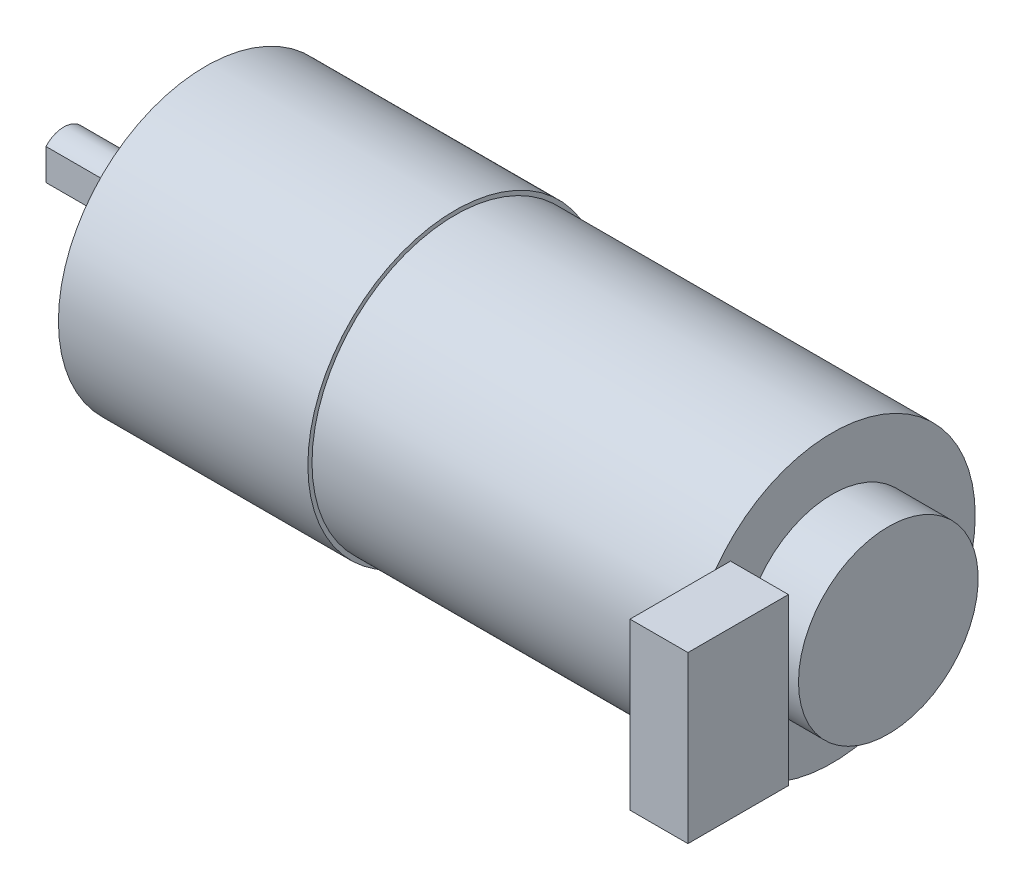
ISO-10303-21;
HEADER;
FILE_DESCRIPTION(('STEP AP214'),'2;1');
FILE_NAME('part.step','',(''),(''),'','','');
FILE_SCHEMA(('AUTOMOTIVE_DESIGN { 1 0 10303 214 1 1 1 1 }'));
ENDSEC;
DATA;
#1=APPLICATION_CONTEXT('core data for automotive mechanical design processes');
#2=APPLICATION_PROTOCOL_DEFINITION('international standard','automotive_design',2000,#1);
#3=PRODUCT_CONTEXT('',#1,'mechanical');
#4=PRODUCT('Part','Part','',(#3));
#5=PRODUCT_RELATED_PRODUCT_CATEGORY('part','',(#4));
#6=PRODUCT_DEFINITION_FORMATION('','',#4);
#7=PRODUCT_DEFINITION_CONTEXT('part definition',#1,'design');
#8=PRODUCT_DEFINITION('design','',#6,#7);
#9=PRODUCT_DEFINITION_SHAPE('','',#8);
#10=(LENGTH_UNIT() NAMED_UNIT(*) SI_UNIT(.MILLI.,.METRE.));
#11=(NAMED_UNIT(*) PLANE_ANGLE_UNIT() SI_UNIT($,.RADIAN.));
#12=(NAMED_UNIT(*) SI_UNIT($,.STERADIAN.) SOLID_ANGLE_UNIT());
#13=UNCERTAINTY_MEASURE_WITH_UNIT(LENGTH_MEASURE(1.E-05),#10,'distance_accuracy_value','');
#14=(GEOMETRIC_REPRESENTATION_CONTEXT(3) GLOBAL_UNCERTAINTY_ASSIGNED_CONTEXT((#13)) GLOBAL_UNIT_ASSIGNED_CONTEXT((#10,
#11,#12)) REPRESENTATION_CONTEXT('',''));
#15=CARTESIAN_POINT('',(0.,0.,0.));
#16=DIRECTION('',(0.,0.,1.));
#17=DIRECTION('',(1.,0.,0.));
#18=AXIS2_PLACEMENT_3D('',#15,#16,#17);
#19=CARTESIAN_POINT('',(-65.,0.,0.));
#20=DIRECTION('',(1.,0.,0.));
#21=DIRECTION('',(0.,0.,-1.));
#22=AXIS2_PLACEMENT_3D('',#19,#20,#21);
#23=PLANE('',#22);
#24=DIRECTION('',(0.,1.,0.));
#25=VECTOR('',#24,1.);
#26=CARTESIAN_POINT('',(-65.,0.,-10.6));
#27=LINE('',#26,#25);
#28=CARTESIAN_POINT('',(-65.,-1.3228756555323,-10.6));
#29=VERTEX_POINT('',#28);
#30=CARTESIAN_POINT('',(-65.,1.3228756555323,-10.6));
#31=VERTEX_POINT('',#30);
#32=EDGE_CURVE('E115',#29,#31,#27,.T.);
#33=ORIENTED_EDGE('',*,*,#32,.T.);
#34=CARTESIAN_POINT('',(-65.,0.,-12.1));
#35=DIRECTION('',(-1.,0.,0.));
#36=DIRECTION('',(0.,0.,1.));
#37=AXIS2_PLACEMENT_3D('',#34,#35,#36);
#38=CIRCLE('',#37,2.);
#39=EDGE_CURVE('E210',#31,#29,#38,.T.);
#40=ORIENTED_EDGE('',*,*,#39,.T.);
#41=EDGE_LOOP('',(#33,#40));
#42=FACE_BOUND('',#41,.T.);
#43=ADVANCED_FACE('F46',(#42),#23,.F.);
#44=CARTESIAN_POINT('',(-65.,0.,-12.1));
#45=DIRECTION('',(-1.,0.,0.));
#46=DIRECTION('',(0.,0.,1.));
#47=AXIS2_PLACEMENT_3D('',#44,#45,#46);
#48=CYLINDRICAL_SURFACE('',#47,2.);
#49=CARTESIAN_POINT('',(-55.5,0.,-12.1));
#50=DIRECTION('',(-1.,0.,0.));
#51=DIRECTION('',(0.,0.,1.));
#52=AXIS2_PLACEMENT_3D('',#49,#50,#51);
#53=CIRCLE('',#52,2.);
#54=CARTESIAN_POINT('',(-55.5,0.,-10.1));
#55=VERTEX_POINT('',#54);
#56=EDGE_CURVE('E206',#55,#55,#53,.T.);
#57=ORIENTED_EDGE('',*,*,#56,.T.);
#58=EDGE_LOOP('',(#57));
#59=FACE_BOUND('',#58,.T.);
#60=DIRECTION('',(-1.,0.,0.));
#61=VECTOR('',#60,1.);
#62=CARTESIAN_POINT('',(-57.,1.3228756555323,-10.6));
#63=LINE('',#62,#61);
#64=CARTESIAN_POINT('',(-57.,1.3228756555323,-10.6));
#65=VERTEX_POINT('',#64);
#66=EDGE_CURVE('E168',#65,#31,#63,.T.);
#67=ORIENTED_EDGE('',*,*,#66,.F.);
#68=CARTESIAN_POINT('',(-57.,0.,-12.1));
#69=DIRECTION('',(-1.,0.,0.));
#70=DIRECTION('',(0.,0.,1.));
#71=AXIS2_PLACEMENT_3D('',#68,#69,#70);
#72=CIRCLE('',#71,2.);
#73=CARTESIAN_POINT('',(-57.,-1.3228756555323,-10.6));
#74=VERTEX_POINT('',#73);
#75=EDGE_CURVE('E160',#74,#65,#72,.T.);
#76=ORIENTED_EDGE('',*,*,#75,.F.);
#77=DIRECTION('',(-1.,0.,0.));
#78=VECTOR('',#77,1.);
#79=CARTESIAN_POINT('',(-57.,-1.3228756555323,-10.6));
#80=LINE('',#79,#78);
#81=EDGE_CURVE('E164',#74,#29,#80,.T.);
#82=ORIENTED_EDGE('',*,*,#81,.T.);
#83=ORIENTED_EDGE('',*,*,#39,.F.);
#84=EDGE_LOOP('',(#67,#76,#82,#83));
#85=FACE_BOUND('',#84,.T.);
#86=ADVANCED_FACE('F249',(#59,#85),#48,.T.);
#87=CARTESIAN_POINT('',(-55.5,0.,2.56739074444567E-13));
#88=DIRECTION('',(1.,0.,0.));
#89=DIRECTION('',(0.,0.,-1.));
#90=AXIS2_PLACEMENT_3D('',#87,#88,#89);
#91=PLANE('',#90);
#92=ORIENTED_EDGE('',*,*,#56,.F.);
#93=EDGE_LOOP('',(#92));
#94=FACE_BOUND('',#93,.T.);
#95=CARTESIAN_POINT('',(-55.5,0.,-12.1));
#96=DIRECTION('',(-1.,0.,0.));
#97=DIRECTION('',(0.,0.,1.));
#98=AXIS2_PLACEMENT_3D('',#95,#96,#97);
#99=CIRCLE('',#98,3.5);
#100=CARTESIAN_POINT('',(-55.5,0.,-8.59999999999999));
#101=VERTEX_POINT('',#100);
#102=EDGE_CURVE('E202',#101,#101,#99,.T.);
#103=ORIENTED_EDGE('',*,*,#102,.T.);
#104=EDGE_LOOP('',(#103));
#105=FACE_BOUND('',#104,.T.);
#106=ADVANCED_FACE('F254',(#94,#105),#91,.F.);
#107=CARTESIAN_POINT('',(-65.,0.,-12.1));
#108=DIRECTION('',(-1.,0.,0.));
#109=DIRECTION('',(0.,0.,1.));
#110=AXIS2_PLACEMENT_3D('',#107,#108,#109);
#111=CYLINDRICAL_SURFACE('',#110,3.5);
#112=ORIENTED_EDGE('',*,*,#102,.F.);
#113=EDGE_LOOP('',(#112));
#114=FACE_BOUND('',#113,.T.);
#115=CARTESIAN_POINT('',(-53.,0.,-12.1));
#116=DIRECTION('',(-1.,0.,0.));
#117=DIRECTION('',(0.,0.,1.));
#118=AXIS2_PLACEMENT_3D('',#115,#116,#117);
#119=CIRCLE('',#118,3.5);
#120=CARTESIAN_POINT('',(-53.,0.,-8.59999999999999));
#121=VERTEX_POINT('',#120);
#122=EDGE_CURVE('E198',#121,#121,#119,.T.);
#123=ORIENTED_EDGE('',*,*,#122,.T.);
#124=EDGE_LOOP('',(#123));
#125=FACE_BOUND('',#124,.T.);
#126=ADVANCED_FACE('F406',(#114,#125),#111,.T.);
#127=CARTESIAN_POINT('',(-53.,0.,0.));
#128=DIRECTION('',(1.,0.,0.));
#129=DIRECTION('',(0.,0.,-1.));
#130=AXIS2_PLACEMENT_3D('',#127,#128,#129);
#131=PLANE('',#130);
#132=ORIENTED_EDGE('',*,*,#122,.F.);
#133=EDGE_LOOP('',(#132));
#134=FACE_BOUND('',#133,.T.);
#135=CARTESIAN_POINT('',(-53.,0.,-12.1));
#136=DIRECTION('',(-1.,0.,0.));
#137=DIRECTION('',(0.,0.,1.));
#138=AXIS2_PLACEMENT_3D('',#135,#136,#137);
#139=CIRCLE('',#138,12.45);
#140=CARTESIAN_POINT('',(-53.,0.,0.35000000000001));
#141=VERTEX_POINT('',#140);
#142=EDGE_CURVE('E194',#141,#141,#139,.T.);
#143=ORIENTED_EDGE('',*,*,#142,.T.);
#144=EDGE_LOOP('',(#143));
#145=FACE_BOUND('',#144,.T.);
#146=ADVANCED_FACE('F395',(#134,#145),#131,.F.);
#147=CARTESIAN_POINT('',(-65.,0.,-12.1));
#148=DIRECTION('',(-1.,0.,0.));
#149=DIRECTION('',(0.,0.,1.));
#150=AXIS2_PLACEMENT_3D('',#147,#148,#149);
#151=CYLINDRICAL_SURFACE('',#150,12.45);
#152=CARTESIAN_POINT('',(-31.9,0.,-12.1));
#153=DIRECTION('',(-1.,0.,0.));
#154=DIRECTION('',(0.,0.,1.));
#155=AXIS2_PLACEMENT_3D('',#152,#153,#154);
#156=CIRCLE('',#155,12.45);
#157=CARTESIAN_POINT('',(-31.9,0.,0.350000000000008));
#158=VERTEX_POINT('',#157);
#159=EDGE_CURVE('E190',#158,#158,#156,.T.);
#160=ORIENTED_EDGE('',*,*,#159,.T.);
#161=EDGE_LOOP('',(#160));
#162=FACE_BOUND('',#161,.T.);
#163=ORIENTED_EDGE('',*,*,#142,.F.);
#164=EDGE_LOOP('',(#163));
#165=FACE_BOUND('',#164,.T.);
#166=ADVANCED_FACE('F384',(#162,#165),#151,.T.);
#167=CARTESIAN_POINT('',(-31.9,0.,6.32430615813249E-13));
#168=DIRECTION('',(1.,0.,0.));
#169=DIRECTION('',(0.,0.,-1.));
#170=AXIS2_PLACEMENT_3D('',#167,#168,#169);
#171=PLANE('',#170);
#172=CARTESIAN_POINT('',(-31.9,0.,-12.1));
#173=DIRECTION('',(-1.,0.,0.));
#174=DIRECTION('',(0.,0.,1.));
#175=AXIS2_PLACEMENT_3D('',#172,#173,#174);
#176=CIRCLE('',#175,12.1);
#177=CARTESIAN_POINT('',(-31.9,0.,0.));
#178=VERTEX_POINT('',#177);
#179=EDGE_CURVE('E186',#178,#178,#176,.T.);
#180=ORIENTED_EDGE('',*,*,#179,.T.);
#181=EDGE_LOOP('',(#180));
#182=FACE_BOUND('',#181,.T.);
#183=ORIENTED_EDGE('',*,*,#159,.F.);
#184=EDGE_LOOP('',(#183));
#185=FACE_BOUND('',#184,.T.);
#186=ADVANCED_FACE('F339',(#182,#185),#171,.T.);
#187=CARTESIAN_POINT('',(-65.,0.,-12.1));
#188=DIRECTION('',(-1.,0.,0.));
#189=DIRECTION('',(0.,0.,1.));
#190=AXIS2_PLACEMENT_3D('',#187,#188,#189);
#191=CYLINDRICAL_SURFACE('',#190,12.1);
#192=ORIENTED_EDGE('',*,*,#179,.F.);
#193=EDGE_LOOP('',(#192));
#194=FACE_BOUND('',#193,.T.);
#195=CARTESIAN_POINT('',(0.,0.,-12.1));
#196=DIRECTION('',(-1.,0.,0.));
#197=DIRECTION('',(0.,0.,1.));
#198=AXIS2_PLACEMENT_3D('',#195,#196,#197);
#199=CIRCLE('',#198,12.1);
#200=CARTESIAN_POINT('',(0.,7.,-2.23034955026268));
#201=VERTEX_POINT('',#200);
#202=CARTESIAN_POINT('',(0.,-7.,-2.23034955026268));
#203=VERTEX_POINT('',#202);
#204=EDGE_CURVE('E183',#201,#203,#199,.T.);
#205=ORIENTED_EDGE('',*,*,#204,.T.);
#206=EDGE_CURVE('E182',#203,#201,#199,.T.);
#207=ORIENTED_EDGE('',*,*,#206,.T.);
#208=EDGE_LOOP('',(#205,#207));
#209=FACE_BOUND('',#208,.T.);
#210=ADVANCED_FACE('F225',(#194,#209),#191,.T.);
#211=CARTESIAN_POINT('',(0.,0.,0.));
#212=DIRECTION('',(-1.,0.,0.));
#213=DIRECTION('',(0.,0.,1.));
#214=AXIS2_PLACEMENT_3D('',#211,#212,#213);
#215=PLANE('',#214);
#216=ORIENTED_EDGE('',*,*,#204,.F.);
#217=DIRECTION('',(0.,0.,-1.));
#218=VECTOR('',#217,1.);
#219=CARTESIAN_POINT('',(0.,7.,0.));
#220=LINE('',#219,#218);
#221=CARTESIAN_POINT('',(0.,7.,-3.5));
#222=VERTEX_POINT('',#221);
#223=EDGE_CURVE('E12',#201,#222,#220,.T.);
#224=ORIENTED_EDGE('',*,*,#223,.T.);
#225=DIRECTION('',(0.,1.,0.));
#226=VECTOR('',#225,1.);
#227=CARTESIAN_POINT('',(0.,0.,-3.5));
#228=LINE('',#227,#226);
#229=CARTESIAN_POINT('',(0.,-7.,-3.5));
#230=VERTEX_POINT('',#229);
#231=EDGE_CURVE('E60',#230,#222,#228,.T.);
#232=ORIENTED_EDGE('',*,*,#231,.F.);
#233=DIRECTION('',(0.,0.,-1.));
#234=VECTOR('',#233,1.);
#235=CARTESIAN_POINT('',(0.,-7.,0.));
#236=LINE('',#235,#234);
#237=EDGE_CURVE('E54',#203,#230,#236,.T.);
#238=ORIENTED_EDGE('',*,*,#237,.F.);
#239=EDGE_LOOP('',(#216,#224,#232,#238));
#240=FACE_BOUND('',#239,.T.);
#241=CARTESIAN_POINT('',(0.,0.,-12.1));
#242=DIRECTION('',(-1.,0.,0.));
#243=DIRECTION('',(0.,0.,1.));
#244=AXIS2_PLACEMENT_3D('',#241,#242,#243);
#245=CIRCLE('',#244,7.6);
#246=CARTESIAN_POINT('',(0.,0.,-4.5));
#247=VERTEX_POINT('',#246);
#248=EDGE_CURVE('E178',#247,#247,#245,.T.);
#249=ORIENTED_EDGE('',*,*,#248,.T.);
#250=EDGE_LOOP('',(#249));
#251=FACE_BOUND('',#250,.T.);
#252=ADVANCED_FACE('F226',(#240,#251),#215,.F.);
#253=CARTESIAN_POINT('',(-65.,0.,-12.1));
#254=DIRECTION('',(-1.,0.,0.));
#255=DIRECTION('',(0.,0.,1.));
#256=AXIS2_PLACEMENT_3D('',#253,#254,#255);
#257=CYLINDRICAL_SURFACE('',#256,7.6);
#258=ORIENTED_EDGE('',*,*,#248,.F.);
#259=EDGE_LOOP('',(#258));
#260=FACE_BOUND('',#259,.T.);
#261=CARTESIAN_POINT('',(4.75,0.,-12.1));
#262=DIRECTION('',(-1.,0.,0.));
#263=DIRECTION('',(0.,0.,1.));
#264=AXIS2_PLACEMENT_3D('',#261,#262,#263);
#265=CIRCLE('',#264,7.6);
#266=CARTESIAN_POINT('',(4.75000000000001,0.,-4.5));
#267=VERTEX_POINT('',#266);
#268=EDGE_CURVE('E171',#267,#267,#265,.T.);
#269=ORIENTED_EDGE('',*,*,#268,.T.);
#270=EDGE_LOOP('',(#269));
#271=FACE_BOUND('',#270,.T.);
#272=ADVANCED_FACE('F229',(#260,#271),#257,.T.);
#273=CARTESIAN_POINT('',(4.75,0.,0.));
#274=DIRECTION('',(-1.,0.,0.));
#275=DIRECTION('',(0.,0.,1.));
#276=AXIS2_PLACEMENT_3D('',#273,#274,#275);
#277=PLANE('',#276);
#278=ORIENTED_EDGE('',*,*,#268,.F.);
#279=EDGE_LOOP('',(#278));
#280=FACE_BOUND('',#279,.T.);
#281=ADVANCED_FACE('F235',(#280),#277,.F.);
#282=CARTESIAN_POINT('',(-57.,0.,-10.6));
#283=DIRECTION('',(0.,0.,1.));
#284=DIRECTION('',(1.,0.,0.));
#285=AXIS2_PLACEMENT_3D('',#282,#283,#284);
#286=PLANE('',#285);
#287=ORIENTED_EDGE('',*,*,#32,.F.);
#288=ORIENTED_EDGE('',*,*,#81,.F.);
#289=DIRECTION('',(0.,1.,0.));
#290=VECTOR('',#289,1.);
#291=CARTESIAN_POINT('',(-57.,0.,-10.6));
#292=LINE('',#291,#290);
#293=EDGE_CURVE('E157',#74,#65,#292,.T.);
#294=ORIENTED_EDGE('',*,*,#293,.T.);
#295=ORIENTED_EDGE('',*,*,#66,.T.);
#296=EDGE_LOOP('',(#287,#288,#294,#295));
#297=FACE_BOUND('',#296,.T.);
#298=ADVANCED_FACE('F240',(#297),#286,.T.);
#299=CARTESIAN_POINT('',(-57.,0.,0.));
#300=DIRECTION('',(-1.,0.,0.));
#301=DIRECTION('',(0.,0.,1.));
#302=AXIS2_PLACEMENT_3D('',#299,#300,#301);
#303=PLANE('',#302);
#304=ORIENTED_EDGE('',*,*,#293,.F.);
#305=ORIENTED_EDGE('',*,*,#75,.T.);
#306=EDGE_LOOP('',(#304,#305));
#307=FACE_BOUND('',#306,.T.);
#308=ADVANCED_FACE('F245',(#307),#303,.T.);
#309=CARTESIAN_POINT('',(4.9,7.,0.));
#310=DIRECTION('',(0.,1.,0.));
#311=DIRECTION('',(0.,0.,1.));
#312=AXIS2_PLACEMENT_3D('',#309,#310,#311);
#313=PLANE('',#312);
#314=DIRECTION('',(0.,0.,-1.));
#315=VECTOR('',#314,1.);
#316=CARTESIAN_POINT('',(0.,7.,0.));
#317=LINE('',#316,#315);
#318=CARTESIAN_POINT('',(0.,7.,5.));
#319=VERTEX_POINT('',#318);
#320=EDGE_CURVE('E109',#319,#201,#317,.T.);
#321=ORIENTED_EDGE('',*,*,#320,.F.);
#322=DIRECTION('',(-1.,0.,0.));
#323=VECTOR('',#322,1.);
#324=CARTESIAN_POINT('',(4.9,7.,5.));
#325=LINE('',#324,#323);
#326=CARTESIAN_POINT('',(4.9,7.,5.));
#327=VERTEX_POINT('',#326);
#328=EDGE_CURVE('E102',#327,#319,#325,.T.);
#329=ORIENTED_EDGE('',*,*,#328,.F.);
#330=DIRECTION('',(0.,0.,-1.));
#331=VECTOR('',#330,1.);
#332=CARTESIAN_POINT('',(4.9,7.,0.));
#333=LINE('',#332,#331);
#334=CARTESIAN_POINT('',(4.9,7.,-3.5));
#335=VERTEX_POINT('',#334);
#336=EDGE_CURVE('E106',#327,#335,#333,.T.);
#337=ORIENTED_EDGE('',*,*,#336,.T.);
#338=DIRECTION('',(-1.,0.,0.));
#339=VECTOR('',#338,1.);
#340=CARTESIAN_POINT('',(4.9,7.,-3.5));
#341=LINE('',#340,#339);
#342=EDGE_CURVE('E137',#335,#222,#341,.T.);
#343=ORIENTED_EDGE('',*,*,#342,.T.);
#344=ORIENTED_EDGE('',*,*,#223,.F.);
#345=EDGE_LOOP('',(#321,#329,#337,#343,#344));
#346=FACE_BOUND('',#345,.T.);
#347=ADVANCED_FACE('F104',(#346),#313,.T.);
#348=CARTESIAN_POINT('',(4.9,0.,5.));
#349=DIRECTION('',(0.,0.,1.));
#350=DIRECTION('',(1.,0.,0.));
#351=AXIS2_PLACEMENT_3D('',#348,#349,#350);
#352=PLANE('',#351);
#353=DIRECTION('',(0.,1.,0.));
#354=VECTOR('',#353,1.);
#355=CARTESIAN_POINT('',(0.,0.,5.));
#356=LINE('',#355,#354);
#357=CARTESIAN_POINT('',(0.,-7.,5.));
#358=VERTEX_POINT('',#357);
#359=EDGE_CURVE('E140',#358,#319,#356,.T.);
#360=ORIENTED_EDGE('',*,*,#359,.F.);
#361=DIRECTION('',(-1.,0.,0.));
#362=VECTOR('',#361,1.);
#363=CARTESIAN_POINT('',(4.9,-7.,5.));
#364=LINE('',#363,#362);
#365=CARTESIAN_POINT('',(4.9,-7.,5.));
#366=VERTEX_POINT('',#365);
#367=EDGE_CURVE('E116',#366,#358,#364,.T.);
#368=ORIENTED_EDGE('',*,*,#367,.F.);
#369=DIRECTION('',(0.,1.,0.));
#370=VECTOR('',#369,1.);
#371=CARTESIAN_POINT('',(4.9,0.,5.));
#372=LINE('',#371,#370);
#373=EDGE_CURVE('E121',#366,#327,#372,.T.);
#374=ORIENTED_EDGE('',*,*,#373,.T.);
#375=ORIENTED_EDGE('',*,*,#328,.T.);
#376=EDGE_LOOP('',(#360,#368,#374,#375));
#377=FACE_BOUND('',#376,.T.);
#378=ADVANCED_FACE('F127',(#377),#352,.T.);
#379=CARTESIAN_POINT('',(4.9,-7.,0.));
#380=DIRECTION('',(0.,1.,0.));
#381=DIRECTION('',(0.,0.,1.));
#382=AXIS2_PLACEMENT_3D('',#379,#380,#381);
#383=PLANE('',#382);
#384=DIRECTION('',(0.,0.,-1.));
#385=VECTOR('',#384,1.);
#386=CARTESIAN_POINT('',(0.,-7.,0.));
#387=LINE('',#386,#385);
#388=EDGE_CURVE('E143',#358,#203,#387,.T.);
#389=ORIENTED_EDGE('',*,*,#388,.T.);
#390=ORIENTED_EDGE('',*,*,#237,.T.);
#391=DIRECTION('',(-1.,0.,0.));
#392=VECTOR('',#391,1.);
#393=CARTESIAN_POINT('',(4.9,-7.,-3.5));
#394=LINE('',#393,#392);
#395=CARTESIAN_POINT('',(4.9,-7.,-3.5));
#396=VERTEX_POINT('',#395);
#397=EDGE_CURVE('E151',#396,#230,#394,.T.);
#398=ORIENTED_EDGE('',*,*,#397,.F.);
#399=DIRECTION('',(0.,0.,-1.));
#400=VECTOR('',#399,1.);
#401=CARTESIAN_POINT('',(4.9,-7.,0.));
#402=LINE('',#401,#400);
#403=EDGE_CURVE('E130',#366,#396,#402,.T.);
#404=ORIENTED_EDGE('',*,*,#403,.F.);
#405=ORIENTED_EDGE('',*,*,#367,.T.);
#406=EDGE_LOOP('',(#389,#390,#398,#404,#405));
#407=FACE_BOUND('',#406,.T.);
#408=ADVANCED_FACE('F216',(#407),#383,.F.);
#409=CARTESIAN_POINT('',(4.9,0.,-3.5));
#410=DIRECTION('',(0.,0.,1.));
#411=DIRECTION('',(1.,0.,0.));
#412=AXIS2_PLACEMENT_3D('',#409,#410,#411);
#413=PLANE('',#412);
#414=ORIENTED_EDGE('',*,*,#231,.T.);
#415=ORIENTED_EDGE('',*,*,#342,.F.);
#416=DIRECTION('',(0.,1.,0.));
#417=VECTOR('',#416,1.);
#418=CARTESIAN_POINT('',(4.9,0.,-3.5));
#419=LINE('',#418,#417);
#420=EDGE_CURVE('E123',#396,#335,#419,.T.);
#421=ORIENTED_EDGE('',*,*,#420,.F.);
#422=ORIENTED_EDGE('',*,*,#397,.T.);
#423=EDGE_LOOP('',(#414,#415,#421,#422));
#424=FACE_BOUND('',#423,.T.);
#425=ADVANCED_FACE('F219',(#424),#413,.F.);
#426=CARTESIAN_POINT('',(4.9,0.,0.));
#427=DIRECTION('',(1.,0.,0.));
#428=DIRECTION('',(0.,0.,-1.));
#429=AXIS2_PLACEMENT_3D('',#426,#427,#428);
#430=PLANE('',#429);
#431=ORIENTED_EDGE('',*,*,#336,.F.);
#432=ORIENTED_EDGE('',*,*,#373,.F.);
#433=ORIENTED_EDGE('',*,*,#403,.T.);
#434=ORIENTED_EDGE('',*,*,#420,.T.);
#435=EDGE_LOOP('',(#431,#432,#433,#434));
#436=FACE_BOUND('',#435,.T.);
#437=ADVANCED_FACE('F120',(#436),#430,.T.);
#438=CARTESIAN_POINT('',(0.,0.,0.));
#439=DIRECTION('',(1.,0.,0.));
#440=DIRECTION('',(0.,0.,-1.));
#441=AXIS2_PLACEMENT_3D('',#438,#439,#440);
#442=PLANE('',#441);
#443=ORIENTED_EDGE('',*,*,#320,.T.);
#444=ORIENTED_EDGE('',*,*,#206,.F.);
#445=ORIENTED_EDGE('',*,*,#388,.F.);
#446=ORIENTED_EDGE('',*,*,#359,.T.);
#447=EDGE_LOOP('',(#443,#444,#445,#446));
#448=FACE_BOUND('',#447,.T.);
#449=ADVANCED_FACE('F222',(#448),#442,.F.);
#450=CLOSED_SHELL('',(#43,#86,#106,#126,#146,#166,#186,#210,#252,#272,#281,#298,#308,#347,#378,
#408,#425,#437,#449));
#451=MANIFOLD_SOLID_BREP('B2',#450);
#452=ADVANCED_BREP_SHAPE_REPRESENTATION('',(#18,#451),#14);
#453=SHAPE_DEFINITION_REPRESENTATION(#9,#452);
ENDSEC;
END-ISO-10303-21;
